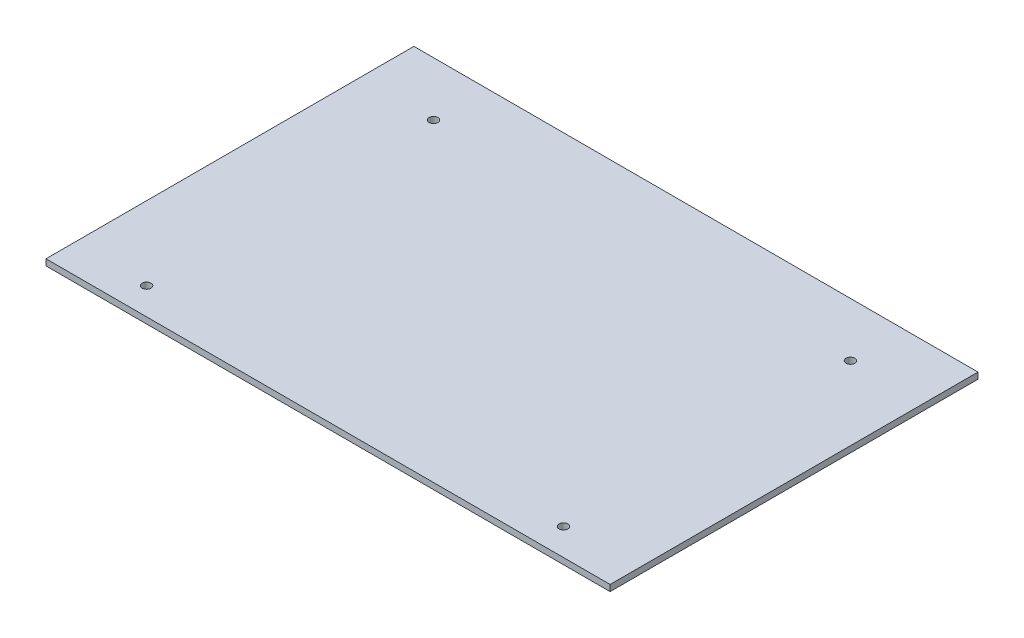
ISO-10303-21;
HEADER;
FILE_DESCRIPTION(('STEP AP214'),'2;1');
FILE_NAME('part.step','',(''),(''),'','','');
FILE_SCHEMA(('AUTOMOTIVE_DESIGN { 1 0 10303 214 1 1 1 1 }'));
ENDSEC;
DATA;
#1=APPLICATION_CONTEXT('core data for automotive mechanical design processes');
#2=APPLICATION_PROTOCOL_DEFINITION('international standard','automotive_design',2000,#1);
#3=PRODUCT_CONTEXT('',#1,'mechanical');
#4=PRODUCT('Part','Part','',(#3));
#5=PRODUCT_RELATED_PRODUCT_CATEGORY('part','',(#4));
#6=PRODUCT_DEFINITION_FORMATION('','',#4);
#7=PRODUCT_DEFINITION_CONTEXT('part definition',#1,'design');
#8=PRODUCT_DEFINITION('design','',#6,#7);
#9=PRODUCT_DEFINITION_SHAPE('','',#8);
#10=(LENGTH_UNIT() NAMED_UNIT(*) SI_UNIT(.MILLI.,.METRE.));
#11=(NAMED_UNIT(*) PLANE_ANGLE_UNIT() SI_UNIT($,.RADIAN.));
#12=(NAMED_UNIT(*) SI_UNIT($,.STERADIAN.) SOLID_ANGLE_UNIT());
#13=UNCERTAINTY_MEASURE_WITH_UNIT(LENGTH_MEASURE(1.E-05),#10,'distance_accuracy_value','');
#14=(GEOMETRIC_REPRESENTATION_CONTEXT(3) GLOBAL_UNCERTAINTY_ASSIGNED_CONTEXT((#13)) GLOBAL_UNIT_ASSIGNED_CONTEXT((#10,
#11,#12)) REPRESENTATION_CONTEXT('',''));
#15=CARTESIAN_POINT('',(0.,0.,0.));
#16=DIRECTION('',(0.,0.,1.));
#17=DIRECTION('',(1.,0.,0.));
#18=AXIS2_PLACEMENT_3D('',#15,#16,#17);
#19=CARTESIAN_POINT('',(0.,12.7,0.));
#20=DIRECTION('',(1.,0.,0.));
#21=DIRECTION('',(0.,0.,-1.));
#22=AXIS2_PLACEMENT_3D('',#19,#20,#21);
#23=PLANE('',#22);
#24=DIRECTION('',(0.,0.,1.));
#25=VECTOR('',#24,1.);
#26=CARTESIAN_POINT('',(0.,0.,0.));
#27=LINE('',#26,#25);
#28=CARTESIAN_POINT('',(0.,0.,0.));
#29=VERTEX_POINT('',#28);
#30=CARTESIAN_POINT('',(0.,0.,750.));
#31=VERTEX_POINT('',#30);
#32=EDGE_CURVE('E103',#29,#31,#27,.T.);
#33=ORIENTED_EDGE('',*,*,#32,.T.);
#34=DIRECTION('',(0.,-1.,0.));
#35=VECTOR('',#34,1.);
#36=CARTESIAN_POINT('',(0.,12.7,750.));
#37=LINE('',#36,#35);
#38=CARTESIAN_POINT('',(0.,12.7,750.));
#39=VERTEX_POINT('',#38);
#40=EDGE_CURVE('E11',#39,#31,#37,.T.);
#41=ORIENTED_EDGE('',*,*,#40,.F.);
#42=DIRECTION('',(0.,0.,1.));
#43=VECTOR('',#42,1.);
#44=CARTESIAN_POINT('',(0.,12.7,0.));
#45=LINE('',#44,#43);
#46=CARTESIAN_POINT('',(0.,12.7,0.));
#47=VERTEX_POINT('',#46);
#48=EDGE_CURVE('E90',#47,#39,#45,.T.);
#49=ORIENTED_EDGE('',*,*,#48,.F.);
#50=DIRECTION('',(0.,-1.,0.));
#51=VECTOR('',#50,1.);
#52=CARTESIAN_POINT('',(0.,12.7,0.));
#53=LINE('',#52,#51);
#54=EDGE_CURVE('E99',#47,#29,#53,.T.);
#55=ORIENTED_EDGE('',*,*,#54,.T.);
#56=EDGE_LOOP('',(#33,#41,#49,#55));
#57=FACE_BOUND('',#56,.T.);
#58=ADVANCED_FACE('F37',(#57),#23,.F.);
#59=CARTESIAN_POINT('',(0.,12.7,750.));
#60=DIRECTION('',(0.,0.,-1.));
#61=DIRECTION('',(-1.,0.,0.));
#62=AXIS2_PLACEMENT_3D('',#59,#60,#61);
#63=PLANE('',#62);
#64=DIRECTION('',(1.,0.,0.));
#65=VECTOR('',#64,1.);
#66=CARTESIAN_POINT('',(0.,0.,750.));
#67=LINE('',#66,#65);
#68=CARTESIAN_POINT('',(1150.,0.,750.));
#69=VERTEX_POINT('',#68);
#70=EDGE_CURVE('E94',#31,#69,#67,.T.);
#71=ORIENTED_EDGE('',*,*,#70,.T.);
#72=DIRECTION('',(0.,-1.,0.));
#73=VECTOR('',#72,1.);
#74=CARTESIAN_POINT('',(1150.,12.7,750.));
#75=LINE('',#74,#73);
#76=CARTESIAN_POINT('',(1150.,12.7,750.));
#77=VERTEX_POINT('',#76);
#78=EDGE_CURVE('E46',#77,#69,#75,.T.);
#79=ORIENTED_EDGE('',*,*,#78,.F.);
#80=DIRECTION('',(1.,0.,0.));
#81=VECTOR('',#80,1.);
#82=CARTESIAN_POINT('',(0.,12.7,750.));
#83=LINE('',#82,#81);
#84=EDGE_CURVE('E85',#39,#77,#83,.T.);
#85=ORIENTED_EDGE('',*,*,#84,.F.);
#86=ORIENTED_EDGE('',*,*,#40,.T.);
#87=EDGE_LOOP('',(#71,#79,#85,#86));
#88=FACE_BOUND('',#87,.T.);
#89=ADVANCED_FACE('F93',(#88),#63,.F.);
#90=CARTESIAN_POINT('',(1150.,12.7,0.));
#91=DIRECTION('',(-1.,0.,0.));
#92=DIRECTION('',(0.,0.,1.));
#93=AXIS2_PLACEMENT_3D('',#90,#91,#92);
#94=PLANE('',#93);
#95=DIRECTION('',(0.,0.,-1.));
#96=VECTOR('',#95,1.);
#97=CARTESIAN_POINT('',(1150.,0.,0.));
#98=LINE('',#97,#96);
#99=CARTESIAN_POINT('',(1150.,0.,0.));
#100=VERTEX_POINT('',#99);
#101=EDGE_CURVE('E72',#69,#100,#98,.T.);
#102=ORIENTED_EDGE('',*,*,#101,.T.);
#103=DIRECTION('',(0.,-1.,0.));
#104=VECTOR('',#103,1.);
#105=CARTESIAN_POINT('',(1150.,12.7,0.));
#106=LINE('',#105,#104);
#107=CARTESIAN_POINT('',(1150.,12.7,0.));
#108=VERTEX_POINT('',#107);
#109=EDGE_CURVE('E95',#108,#100,#106,.T.);
#110=ORIENTED_EDGE('',*,*,#109,.F.);
#111=DIRECTION('',(0.,0.,-1.));
#112=VECTOR('',#111,1.);
#113=CARTESIAN_POINT('',(1150.,12.7,0.));
#114=LINE('',#113,#112);
#115=EDGE_CURVE('E88',#77,#108,#114,.T.);
#116=ORIENTED_EDGE('',*,*,#115,.F.);
#117=ORIENTED_EDGE('',*,*,#78,.T.);
#118=EDGE_LOOP('',(#102,#110,#116,#117));
#119=FACE_BOUND('',#118,.T.);
#120=ADVANCED_FACE('F97',(#119),#94,.F.);
#121=CARTESIAN_POINT('',(0.,12.7,0.));
#122=DIRECTION('',(0.,0.,1.));
#123=DIRECTION('',(1.,0.,0.));
#124=AXIS2_PLACEMENT_3D('',#121,#122,#123);
#125=PLANE('',#124);
#126=DIRECTION('',(-1.,0.,0.));
#127=VECTOR('',#126,1.);
#128=CARTESIAN_POINT('',(0.,0.,0.));
#129=LINE('',#128,#127);
#130=EDGE_CURVE('E78',#100,#29,#129,.T.);
#131=ORIENTED_EDGE('',*,*,#130,.T.);
#132=ORIENTED_EDGE('',*,*,#54,.F.);
#133=DIRECTION('',(-1.,0.,0.));
#134=VECTOR('',#133,1.);
#135=CARTESIAN_POINT('',(0.,12.7,0.));
#136=LINE('',#135,#134);
#137=EDGE_CURVE('E55',#108,#47,#136,.T.);
#138=ORIENTED_EDGE('',*,*,#137,.F.);
#139=ORIENTED_EDGE('',*,*,#109,.T.);
#140=EDGE_LOOP('',(#131,#132,#138,#139));
#141=FACE_BOUND('',#140,.T.);
#142=ADVANCED_FACE('F145',(#141),#125,.F.);
#143=CARTESIAN_POINT('',(0.,12.7,0.));
#144=DIRECTION('',(0.,1.,0.));
#145=DIRECTION('',(0.,0.,1.));
#146=AXIS2_PLACEMENT_3D('',#143,#144,#145);
#147=PLANE('',#146);
#148=CARTESIAN_POINT('',(150.,12.7,110.));
#149=DIRECTION('',(0.,1.,0.));
#150=DIRECTION('',(0.,0.,1.));
#151=AXIS2_PLACEMENT_3D('',#148,#149,#150);
#152=CIRCLE('',#151,9.00000000000001);
#153=CARTESIAN_POINT('',(150.,12.7,119.));
#154=VERTEX_POINT('',#153);
#155=EDGE_CURVE('E118',#154,#154,#152,.T.);
#156=ORIENTED_EDGE('',*,*,#155,.F.);
#157=EDGE_LOOP('',(#156));
#158=FACE_BOUND('',#157,.T.);
#159=CARTESIAN_POINT('',(1000.,12.7,695.));
#160=DIRECTION('',(0.,1.,0.));
#161=DIRECTION('',(0.,0.,1.));
#162=AXIS2_PLACEMENT_3D('',#159,#160,#161);
#163=CIRCLE('',#162,9.00000000000004);
#164=CARTESIAN_POINT('',(1000.,12.7,704.));
#165=VERTEX_POINT('',#164);
#166=EDGE_CURVE('E133',#165,#165,#163,.T.);
#167=ORIENTED_EDGE('',*,*,#166,.F.);
#168=EDGE_LOOP('',(#167));
#169=FACE_BOUND('',#168,.T.);
#170=CARTESIAN_POINT('',(150.,12.7,695.));
#171=DIRECTION('',(0.,1.,0.));
#172=DIRECTION('',(0.,0.,1.));
#173=AXIS2_PLACEMENT_3D('',#170,#171,#172);
#174=CIRCLE('',#173,9.00000000000001);
#175=CARTESIAN_POINT('',(150.,12.7,704.));
#176=VERTEX_POINT('',#175);
#177=EDGE_CURVE('E130',#176,#176,#174,.T.);
#178=ORIENTED_EDGE('',*,*,#177,.F.);
#179=EDGE_LOOP('',(#178));
#180=FACE_BOUND('',#179,.T.);
#181=CARTESIAN_POINT('',(1000.,12.7,110.));
#182=DIRECTION('',(0.,1.,0.));
#183=DIRECTION('',(0.,0.,1.));
#184=AXIS2_PLACEMENT_3D('',#181,#182,#183);
#185=CIRCLE('',#184,9.00000000000005);
#186=CARTESIAN_POINT('',(1000.,12.7,119.));
#187=VERTEX_POINT('',#186);
#188=EDGE_CURVE('E114',#187,#187,#185,.T.);
#189=ORIENTED_EDGE('',*,*,#188,.F.);
#190=EDGE_LOOP('',(#189));
#191=FACE_BOUND('',#190,.T.);
#192=ORIENTED_EDGE('',*,*,#48,.T.);
#193=ORIENTED_EDGE('',*,*,#84,.T.);
#194=ORIENTED_EDGE('',*,*,#115,.T.);
#195=ORIENTED_EDGE('',*,*,#137,.T.);
#196=EDGE_LOOP('',(#192,#193,#194,#195));
#197=FACE_BOUND('',#196,.T.);
#198=ADVANCED_FACE('F86',(#158,#169,#180,#191,#197),#147,.T.);
#199=CARTESIAN_POINT('',(0.,0.,0.));
#200=DIRECTION('',(0.,1.,0.));
#201=DIRECTION('',(0.,0.,1.));
#202=AXIS2_PLACEMENT_3D('',#199,#200,#201);
#203=PLANE('',#202);
#204=CARTESIAN_POINT('',(150.,0.,110.));
#205=DIRECTION('',(0.,1.,0.));
#206=DIRECTION('',(0.,0.,1.));
#207=AXIS2_PLACEMENT_3D('',#204,#205,#206);
#208=CIRCLE('',#207,9.00000000000001);
#209=CARTESIAN_POINT('',(150.,0.,119.));
#210=VERTEX_POINT('',#209);
#211=EDGE_CURVE('E40',#210,#210,#208,.T.);
#212=ORIENTED_EDGE('',*,*,#211,.T.);
#213=EDGE_LOOP('',(#212));
#214=FACE_BOUND('',#213,.T.);
#215=CARTESIAN_POINT('',(1000.,0.,695.));
#216=DIRECTION('',(0.,1.,0.));
#217=DIRECTION('',(0.,0.,1.));
#218=AXIS2_PLACEMENT_3D('',#215,#216,#217);
#219=CIRCLE('',#218,9.00000000000004);
#220=CARTESIAN_POINT('',(1000.,0.,704.));
#221=VERTEX_POINT('',#220);
#222=EDGE_CURVE('E117',#221,#221,#219,.T.);
#223=ORIENTED_EDGE('',*,*,#222,.T.);
#224=EDGE_LOOP('',(#223));
#225=FACE_BOUND('',#224,.T.);
#226=CARTESIAN_POINT('',(150.,0.,695.));
#227=DIRECTION('',(0.,1.,0.));
#228=DIRECTION('',(0.,0.,1.));
#229=AXIS2_PLACEMENT_3D('',#226,#227,#228);
#230=CIRCLE('',#229,9.00000000000001);
#231=CARTESIAN_POINT('',(150.,0.,704.));
#232=VERTEX_POINT('',#231);
#233=EDGE_CURVE('E115',#232,#232,#230,.T.);
#234=ORIENTED_EDGE('',*,*,#233,.T.);
#235=EDGE_LOOP('',(#234));
#236=FACE_BOUND('',#235,.T.);
#237=CARTESIAN_POINT('',(1000.,0.,110.));
#238=DIRECTION('',(0.,1.,0.));
#239=DIRECTION('',(0.,0.,1.));
#240=AXIS2_PLACEMENT_3D('',#237,#238,#239);
#241=CIRCLE('',#240,9.00000000000005);
#242=CARTESIAN_POINT('',(1000.,0.,119.));
#243=VERTEX_POINT('',#242);
#244=EDGE_CURVE('E106',#243,#243,#241,.T.);
#245=ORIENTED_EDGE('',*,*,#244,.T.);
#246=EDGE_LOOP('',(#245));
#247=FACE_BOUND('',#246,.T.);
#248=ORIENTED_EDGE('',*,*,#32,.F.);
#249=ORIENTED_EDGE('',*,*,#130,.F.);
#250=ORIENTED_EDGE('',*,*,#101,.F.);
#251=ORIENTED_EDGE('',*,*,#70,.F.);
#252=EDGE_LOOP('',(#248,#249,#250,#251));
#253=FACE_BOUND('',#252,.T.);
#254=ADVANCED_FACE('F144',(#214,#225,#236,#247,#253),#203,.F.);
#255=CARTESIAN_POINT('',(1000.,-107.3,110.));
#256=DIRECTION('',(0.,1.,0.));
#257=DIRECTION('',(0.,0.,1.));
#258=AXIS2_PLACEMENT_3D('',#255,#256,#257);
#259=CYLINDRICAL_SURFACE('',#258,9.00000000000005);
#260=ORIENTED_EDGE('',*,*,#188,.T.);
#261=EDGE_LOOP('',(#260));
#262=FACE_BOUND('',#261,.T.);
#263=ORIENTED_EDGE('',*,*,#244,.F.);
#264=EDGE_LOOP('',(#263));
#265=FACE_BOUND('',#264,.T.);
#266=ADVANCED_FACE('F156',(#262,#265),#259,.F.);
#267=CARTESIAN_POINT('',(150.,-107.3,695.));
#268=DIRECTION('',(0.,1.,0.));
#269=DIRECTION('',(0.,0.,1.));
#270=AXIS2_PLACEMENT_3D('',#267,#268,#269);
#271=CYLINDRICAL_SURFACE('',#270,9.00000000000001);
#272=ORIENTED_EDGE('',*,*,#177,.T.);
#273=EDGE_LOOP('',(#272));
#274=FACE_BOUND('',#273,.T.);
#275=ORIENTED_EDGE('',*,*,#233,.F.);
#276=EDGE_LOOP('',(#275));
#277=FACE_BOUND('',#276,.T.);
#278=ADVANCED_FACE('F152',(#274,#277),#271,.F.);
#279=CARTESIAN_POINT('',(1000.,-107.3,695.));
#280=DIRECTION('',(0.,1.,0.));
#281=DIRECTION('',(0.,0.,1.));
#282=AXIS2_PLACEMENT_3D('',#279,#280,#281);
#283=CYLINDRICAL_SURFACE('',#282,9.00000000000004);
#284=ORIENTED_EDGE('',*,*,#166,.T.);
#285=EDGE_LOOP('',(#284));
#286=FACE_BOUND('',#285,.T.);
#287=ORIENTED_EDGE('',*,*,#222,.F.);
#288=EDGE_LOOP('',(#287));
#289=FACE_BOUND('',#288,.T.);
#290=ADVANCED_FACE('F155',(#286,#289),#283,.F.);
#291=CARTESIAN_POINT('',(150.,-107.3,110.));
#292=DIRECTION('',(0.,1.,0.));
#293=DIRECTION('',(0.,0.,1.));
#294=AXIS2_PLACEMENT_3D('',#291,#292,#293);
#295=CYLINDRICAL_SURFACE('',#294,9.00000000000001);
#296=ORIENTED_EDGE('',*,*,#155,.T.);
#297=EDGE_LOOP('',(#296));
#298=FACE_BOUND('',#297,.T.);
#299=ORIENTED_EDGE('',*,*,#211,.F.);
#300=EDGE_LOOP('',(#299));
#301=FACE_BOUND('',#300,.T.);
#302=ADVANCED_FACE('F139',(#298,#301),#295,.F.);
#303=CLOSED_SHELL('',(#58,#89,#120,#142,#198,#254,#266,#278,#290,#302));
#304=MANIFOLD_SOLID_BREP('B2',#303);
#305=ADVANCED_BREP_SHAPE_REPRESENTATION('',(#18,#304),#14);
#306=SHAPE_DEFINITION_REPRESENTATION(#9,#305);
ENDSEC;
END-ISO-10303-21;
